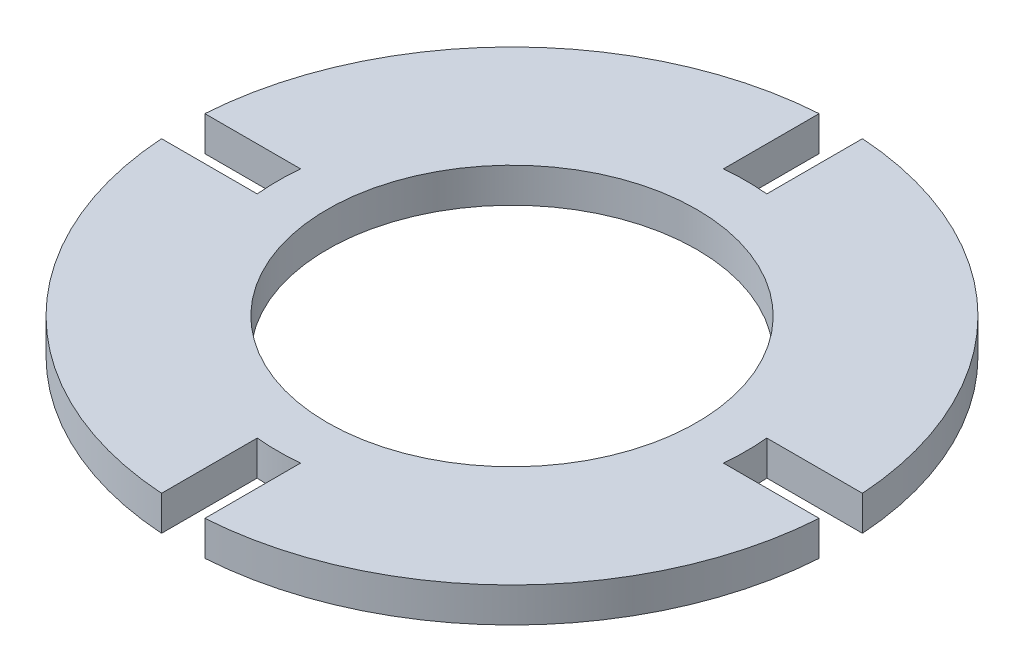
ISO-10303-21;
HEADER;
FILE_DESCRIPTION(('STEP AP214'),'2;1');
FILE_NAME('part.step','',(''),(''),'','','');
FILE_SCHEMA(('AUTOMOTIVE_DESIGN { 1 0 10303 214 1 1 1 1 }'));
ENDSEC;
DATA;
#1=APPLICATION_CONTEXT('core data for automotive mechanical design processes');
#2=APPLICATION_PROTOCOL_DEFINITION('international standard','automotive_design',2000,#1);
#3=PRODUCT_CONTEXT('',#1,'mechanical');
#4=PRODUCT('Part','Part','',(#3));
#5=PRODUCT_RELATED_PRODUCT_CATEGORY('part','',(#4));
#6=PRODUCT_DEFINITION_FORMATION('','',#4);
#7=PRODUCT_DEFINITION_CONTEXT('part definition',#1,'design');
#8=PRODUCT_DEFINITION('design','',#6,#7);
#9=PRODUCT_DEFINITION_SHAPE('','',#8);
#10=(LENGTH_UNIT() NAMED_UNIT(*) SI_UNIT(.MILLI.,.METRE.));
#11=(NAMED_UNIT(*) PLANE_ANGLE_UNIT() SI_UNIT($,.RADIAN.));
#12=(NAMED_UNIT(*) SI_UNIT($,.STERADIAN.) SOLID_ANGLE_UNIT());
#13=UNCERTAINTY_MEASURE_WITH_UNIT(LENGTH_MEASURE(1.E-05),#10,'distance_accuracy_value','');
#14=(GEOMETRIC_REPRESENTATION_CONTEXT(3) GLOBAL_UNCERTAINTY_ASSIGNED_CONTEXT((#13)) GLOBAL_UNIT_ASSIGNED_CONTEXT((#10,
#11,#12)) REPRESENTATION_CONTEXT('',''));
#15=CARTESIAN_POINT('',(0.,0.,0.));
#16=DIRECTION('',(0.,0.,1.));
#17=DIRECTION('',(1.,0.,0.));
#18=AXIS2_PLACEMENT_3D('',#15,#16,#17);
#19=CARTESIAN_POINT('',(3.17500000000001,5.08,0.));
#20=DIRECTION('',(1.,0.,0.));
#21=DIRECTION('',(0.,0.,-1.));
#22=AXIS2_PLACEMENT_3D('',#19,#20,#21);
#23=PLANE('',#22);
#24=DIRECTION('',(0.,0.,1.));
#25=VECTOR('',#24,1.);
#26=CARTESIAN_POINT('',(3.17500000000001,0.,0.));
#27=LINE('',#26,#25);
#28=CARTESIAN_POINT('',(3.17500000000001,0.,-48.1554459537029));
#29=VERTEX_POINT('',#28);
#30=CARTESIAN_POINT('',(3.17500000000001,0.,-34.142692849276));
#31=VERTEX_POINT('',#30);
#32=EDGE_CURVE('E183',#29,#31,#27,.T.);
#33=ORIENTED_EDGE('',*,*,#32,.T.);
#34=DIRECTION('',(0.,-1.,0.));
#35=VECTOR('',#34,1.);
#36=CARTESIAN_POINT('',(3.17500000000001,5.08,-34.142692849276));
#37=LINE('',#36,#35);
#38=CARTESIAN_POINT('',(3.17500000000001,5.08,-34.142692849276));
#39=VERTEX_POINT('',#38);
#40=EDGE_CURVE('E11',#39,#31,#37,.T.);
#41=ORIENTED_EDGE('',*,*,#40,.F.);
#42=DIRECTION('',(0.,0.,1.));
#43=VECTOR('',#42,1.);
#44=CARTESIAN_POINT('',(3.17500000000001,5.08,0.));
#45=LINE('',#44,#43);
#46=CARTESIAN_POINT('',(3.17500000000001,5.08,-48.1554459537029));
#47=VERTEX_POINT('',#46);
#48=EDGE_CURVE('E312',#47,#39,#45,.T.);
#49=ORIENTED_EDGE('',*,*,#48,.F.);
#50=DIRECTION('',(0.,-1.,0.));
#51=VECTOR('',#50,1.);
#52=CARTESIAN_POINT('',(3.17500000000001,5.08,-48.1554459537029));
#53=LINE('',#52,#51);
#54=EDGE_CURVE('E177',#47,#29,#53,.T.);
#55=ORIENTED_EDGE('',*,*,#54,.T.);
#56=EDGE_LOOP('',(#33,#41,#49,#55));
#57=FACE_BOUND('',#56,.T.);
#58=ADVANCED_FACE('F38',(#57),#23,.F.);
#59=CARTESIAN_POINT('',(0.,5.08,0.));
#60=DIRECTION('',(0.,-1.,0.));
#61=DIRECTION('',(0.,0.,-1.));
#62=AXIS2_PLACEMENT_3D('',#59,#60,#61);
#63=CYLINDRICAL_SURFACE('',#62,34.29);
#64=CARTESIAN_POINT('',(0.,0.,0.));
#65=DIRECTION('',(0.,1.,0.));
#66=DIRECTION('',(0.,0.,1.));
#67=AXIS2_PLACEMENT_3D('',#64,#65,#66);
#68=CIRCLE('',#67,34.29);
#69=CARTESIAN_POINT('',(-3.17500000000001,0.,-34.142692849276));
#70=VERTEX_POINT('',#69);
#71=EDGE_CURVE('E186',#31,#70,#68,.T.);
#72=ORIENTED_EDGE('',*,*,#71,.T.);
#73=DIRECTION('',(0.,-1.,0.));
#74=VECTOR('',#73,1.);
#75=CARTESIAN_POINT('',(-3.17500000000001,5.08,-34.142692849276));
#76=LINE('',#75,#74);
#77=CARTESIAN_POINT('',(-3.17500000000001,5.08,-34.142692849276));
#78=VERTEX_POINT('',#77);
#79=EDGE_CURVE('E46',#78,#70,#76,.T.);
#80=ORIENTED_EDGE('',*,*,#79,.F.);
#81=CARTESIAN_POINT('',(0.,5.08,0.));
#82=DIRECTION('',(0.,1.,0.));
#83=DIRECTION('',(0.,0.,1.));
#84=AXIS2_PLACEMENT_3D('',#81,#82,#83);
#85=CIRCLE('',#84,34.29);
#86=EDGE_CURVE('E121',#39,#78,#85,.T.);
#87=ORIENTED_EDGE('',*,*,#86,.F.);
#88=ORIENTED_EDGE('',*,*,#40,.T.);
#89=EDGE_LOOP('',(#72,#80,#87,#88));
#90=FACE_BOUND('',#89,.T.);
#91=ADVANCED_FACE('F249',(#90),#63,.T.);
#92=CARTESIAN_POINT('',(-3.17500000000001,5.08,0.));
#93=DIRECTION('',(1.,0.,0.));
#94=DIRECTION('',(0.,0.,-1.));
#95=AXIS2_PLACEMENT_3D('',#92,#93,#94);
#96=PLANE('',#95);
#97=DIRECTION('',(0.,0.,1.));
#98=VECTOR('',#97,1.);
#99=CARTESIAN_POINT('',(-3.17500000000001,0.,0.));
#100=LINE('',#99,#98);
#101=CARTESIAN_POINT('',(-3.17500000000001,0.,-48.1554459537029));
#102=VERTEX_POINT('',#101);
#103=EDGE_CURVE('E190',#102,#70,#100,.T.);
#104=ORIENTED_EDGE('',*,*,#103,.F.);
#105=DIRECTION('',(0.,-1.,0.));
#106=VECTOR('',#105,1.);
#107=CARTESIAN_POINT('',(-3.17500000000001,5.08,-48.1554459537029));
#108=LINE('',#107,#106);
#109=CARTESIAN_POINT('',(-3.17500000000001,5.08,-48.1554459537029));
#110=VERTEX_POINT('',#109);
#111=EDGE_CURVE('E242',#110,#102,#108,.T.);
#112=ORIENTED_EDGE('',*,*,#111,.F.);
#113=DIRECTION('',(0.,0.,1.));
#114=VECTOR('',#113,1.);
#115=CARTESIAN_POINT('',(-3.17500000000001,5.08,0.));
#116=LINE('',#115,#114);
#117=EDGE_CURVE('E248',#110,#78,#116,.T.);
#118=ORIENTED_EDGE('',*,*,#117,.T.);
#119=ORIENTED_EDGE('',*,*,#79,.T.);
#120=EDGE_LOOP('',(#104,#112,#118,#119));
#121=FACE_BOUND('',#120,.T.);
#122=ADVANCED_FACE('F246',(#121),#96,.T.);
#123=CARTESIAN_POINT('',(0.,5.08,0.));
#124=DIRECTION('',(0.,-1.,0.));
#125=DIRECTION('',(0.,0.,-1.));
#126=AXIS2_PLACEMENT_3D('',#123,#124,#125);
#127=CYLINDRICAL_SURFACE('',#126,48.26);
#128=CARTESIAN_POINT('',(0.,0.,0.));
#129=DIRECTION('',(0.,1.,0.));
#130=DIRECTION('',(0.,0.,1.));
#131=AXIS2_PLACEMENT_3D('',#128,#129,#130);
#132=CIRCLE('',#131,48.26);
#133=CARTESIAN_POINT('',(-48.1554459537029,0.,-3.17500000000001));
#134=VERTEX_POINT('',#133);
#135=EDGE_CURVE('E193',#102,#134,#132,.T.);
#136=ORIENTED_EDGE('',*,*,#135,.T.);
#137=DIRECTION('',(0.,-1.,0.));
#138=VECTOR('',#137,1.);
#139=CARTESIAN_POINT('',(-48.1554459537029,5.08,-3.17500000000001));
#140=LINE('',#139,#138);
#141=CARTESIAN_POINT('',(-48.1554459537029,5.08,-3.17500000000001));
#142=VERTEX_POINT('',#141);
#143=EDGE_CURVE('E239',#142,#134,#140,.T.);
#144=ORIENTED_EDGE('',*,*,#143,.F.);
#145=CARTESIAN_POINT('',(0.,5.08,0.));
#146=DIRECTION('',(0.,1.,0.));
#147=DIRECTION('',(0.,0.,1.));
#148=AXIS2_PLACEMENT_3D('',#145,#146,#147);
#149=CIRCLE('',#148,48.26);
#150=EDGE_CURVE('E180',#110,#142,#149,.T.);
#151=ORIENTED_EDGE('',*,*,#150,.F.);
#152=ORIENTED_EDGE('',*,*,#111,.T.);
#153=EDGE_LOOP('',(#136,#144,#151,#152));
#154=FACE_BOUND('',#153,.T.);
#155=ADVANCED_FACE('F259',(#154),#127,.T.);
#156=CARTESIAN_POINT('',(0.,5.08,-3.17500000000001));
#157=DIRECTION('',(0.,0.,-1.));
#158=DIRECTION('',(-1.,0.,0.));
#159=AXIS2_PLACEMENT_3D('',#156,#157,#158);
#160=PLANE('',#159);
#161=DIRECTION('',(1.,0.,0.));
#162=VECTOR('',#161,1.);
#163=CARTESIAN_POINT('',(0.,0.,-3.17500000000001));
#164=LINE('',#163,#162);
#165=CARTESIAN_POINT('',(-34.142692849276,0.,-3.17500000000001));
#166=VERTEX_POINT('',#165);
#167=EDGE_CURVE('E195',#134,#166,#164,.T.);
#168=ORIENTED_EDGE('',*,*,#167,.T.);
#169=DIRECTION('',(0.,-1.,0.));
#170=VECTOR('',#169,1.);
#171=CARTESIAN_POINT('',(-34.142692849276,5.08,-3.17500000000001));
#172=LINE('',#171,#170);
#173=CARTESIAN_POINT('',(-34.142692849276,5.08,-3.17500000000001));
#174=VERTEX_POINT('',#173);
#175=EDGE_CURVE('E236',#174,#166,#172,.T.);
#176=ORIENTED_EDGE('',*,*,#175,.F.);
#177=DIRECTION('',(1.,0.,0.));
#178=VECTOR('',#177,1.);
#179=CARTESIAN_POINT('',(0.,5.08,-3.17500000000001));
#180=LINE('',#179,#178);
#181=EDGE_CURVE('E265',#142,#174,#180,.T.);
#182=ORIENTED_EDGE('',*,*,#181,.F.);
#183=ORIENTED_EDGE('',*,*,#143,.T.);
#184=EDGE_LOOP('',(#168,#176,#182,#183));
#185=FACE_BOUND('',#184,.T.);
#186=ADVANCED_FACE('F263',(#185),#160,.F.);
#187=CARTESIAN_POINT('',(0.,5.08,0.));
#188=DIRECTION('',(0.,-1.,0.));
#189=DIRECTION('',(0.,0.,-1.));
#190=AXIS2_PLACEMENT_3D('',#187,#188,#189);
#191=CYLINDRICAL_SURFACE('',#190,34.29);
#192=CARTESIAN_POINT('',(0.,0.,0.));
#193=DIRECTION('',(0.,1.,0.));
#194=DIRECTION('',(0.,0.,1.));
#195=AXIS2_PLACEMENT_3D('',#192,#193,#194);
#196=CIRCLE('',#195,34.29);
#197=CARTESIAN_POINT('',(-34.142692849276,0.,3.17500000000001));
#198=VERTEX_POINT('',#197);
#199=EDGE_CURVE('E198',#166,#198,#196,.T.);
#200=ORIENTED_EDGE('',*,*,#199,.T.);
#201=DIRECTION('',(0.,-1.,0.));
#202=VECTOR('',#201,1.);
#203=CARTESIAN_POINT('',(-34.142692849276,5.08,3.17500000000001));
#204=LINE('',#203,#202);
#205=CARTESIAN_POINT('',(-34.142692849276,5.08,3.17500000000001));
#206=VERTEX_POINT('',#205);
#207=EDGE_CURVE('E234',#206,#198,#204,.T.);
#208=ORIENTED_EDGE('',*,*,#207,.F.);
#209=CARTESIAN_POINT('',(0.,5.08,0.));
#210=DIRECTION('',(0.,1.,0.));
#211=DIRECTION('',(0.,0.,1.));
#212=AXIS2_PLACEMENT_3D('',#209,#210,#211);
#213=CIRCLE('',#212,34.29);
#214=EDGE_CURVE('E267',#174,#206,#213,.T.);
#215=ORIENTED_EDGE('',*,*,#214,.F.);
#216=ORIENTED_EDGE('',*,*,#175,.T.);
#217=EDGE_LOOP('',(#200,#208,#215,#216));
#218=FACE_BOUND('',#217,.T.);
#219=ADVANCED_FACE('F351',(#218),#191,.T.);
#220=CARTESIAN_POINT('',(0.,5.08,3.17500000000001));
#221=DIRECTION('',(0.,0.,-1.));
#222=DIRECTION('',(-1.,0.,0.));
#223=AXIS2_PLACEMENT_3D('',#220,#221,#222);
#224=PLANE('',#223);
#225=DIRECTION('',(1.,0.,0.));
#226=VECTOR('',#225,1.);
#227=CARTESIAN_POINT('',(0.,0.,3.17500000000001));
#228=LINE('',#227,#226);
#229=CARTESIAN_POINT('',(-48.1554459537029,0.,3.17500000000001));
#230=VERTEX_POINT('',#229);
#231=EDGE_CURVE('E201',#230,#198,#228,.T.);
#232=ORIENTED_EDGE('',*,*,#231,.F.);
#233=DIRECTION('',(0.,-1.,0.));
#234=VECTOR('',#233,1.);
#235=CARTESIAN_POINT('',(-48.1554459537029,5.08,3.17500000000001));
#236=LINE('',#235,#234);
#237=CARTESIAN_POINT('',(-48.1554459537029,5.08,3.17500000000001));
#238=VERTEX_POINT('',#237);
#239=EDGE_CURVE('E232',#238,#230,#236,.T.);
#240=ORIENTED_EDGE('',*,*,#239,.F.);
#241=DIRECTION('',(1.,0.,0.));
#242=VECTOR('',#241,1.);
#243=CARTESIAN_POINT('',(0.,5.08,3.17500000000001));
#244=LINE('',#243,#242);
#245=EDGE_CURVE('E269',#238,#206,#244,.T.);
#246=ORIENTED_EDGE('',*,*,#245,.T.);
#247=ORIENTED_EDGE('',*,*,#207,.T.);
#248=EDGE_LOOP('',(#232,#240,#246,#247));
#249=FACE_BOUND('',#248,.T.);
#250=ADVANCED_FACE('F354',(#249),#224,.T.);
#251=CARTESIAN_POINT('',(-3.175,0.,48.1554459537029));
#252=VERTEX_POINT('',#251);
#253=EDGE_CURVE('E196',#230,#252,#132,.T.);
#254=ORIENTED_EDGE('',*,*,#253,.T.);
#255=DIRECTION('',(0.,-1.,0.));
#256=VECTOR('',#255,1.);
#257=CARTESIAN_POINT('',(-3.175,5.08,48.1554459537029));
#258=LINE('',#257,#256);
#259=CARTESIAN_POINT('',(-3.175,5.08,48.1554459537029));
#260=VERTEX_POINT('',#259);
#261=EDGE_CURVE('E230',#260,#252,#258,.T.);
#262=ORIENTED_EDGE('',*,*,#261,.F.);
#263=EDGE_CURVE('E271',#238,#260,#149,.T.);
#264=ORIENTED_EDGE('',*,*,#263,.F.);
#265=ORIENTED_EDGE('',*,*,#239,.T.);
#266=EDGE_LOOP('',(#254,#262,#264,#265));
#267=FACE_BOUND('',#266,.T.);
#268=ADVANCED_FACE('F291',(#267),#127,.T.);
#269=CARTESIAN_POINT('',(-3.17500000000001,5.08,0.));
#270=DIRECTION('',(1.,0.,0.));
#271=DIRECTION('',(0.,0.,-1.));
#272=AXIS2_PLACEMENT_3D('',#269,#270,#271);
#273=PLANE('',#272);
#274=DIRECTION('',(0.,0.,1.));
#275=VECTOR('',#274,1.);
#276=CARTESIAN_POINT('',(-3.17500000000001,0.,0.));
#277=LINE('',#276,#275);
#278=CARTESIAN_POINT('',(-3.175,0.,34.142692849276));
#279=VERTEX_POINT('',#278);
#280=EDGE_CURVE('E204',#279,#252,#277,.T.);
#281=ORIENTED_EDGE('',*,*,#280,.F.);
#282=DIRECTION('',(0.,-1.,0.));
#283=VECTOR('',#282,1.);
#284=CARTESIAN_POINT('',(-3.175,5.08,34.142692849276));
#285=LINE('',#284,#283);
#286=CARTESIAN_POINT('',(-3.175,5.08,34.142692849276));
#287=VERTEX_POINT('',#286);
#288=EDGE_CURVE('E228',#287,#279,#285,.T.);
#289=ORIENTED_EDGE('',*,*,#288,.F.);
#290=DIRECTION('',(0.,0.,1.));
#291=VECTOR('',#290,1.);
#292=CARTESIAN_POINT('',(-3.17500000000001,5.08,0.));
#293=LINE('',#292,#291);
#294=EDGE_CURVE('E276',#287,#260,#293,.T.);
#295=ORIENTED_EDGE('',*,*,#294,.T.);
#296=ORIENTED_EDGE('',*,*,#261,.T.);
#297=EDGE_LOOP('',(#281,#289,#295,#296));
#298=FACE_BOUND('',#297,.T.);
#299=ADVANCED_FACE('F295',(#298),#273,.T.);
#300=CARTESIAN_POINT('',(0.,5.08,0.));
#301=DIRECTION('',(0.,-1.,0.));
#302=DIRECTION('',(0.,0.,-1.));
#303=AXIS2_PLACEMENT_3D('',#300,#301,#302);
#304=CYLINDRICAL_SURFACE('',#303,34.29);
#305=CARTESIAN_POINT('',(0.,0.,0.));
#306=DIRECTION('',(0.,1.,0.));
#307=DIRECTION('',(0.,0.,1.));
#308=AXIS2_PLACEMENT_3D('',#305,#306,#307);
#309=CIRCLE('',#308,34.29);
#310=CARTESIAN_POINT('',(3.175,0.,34.142692849276));
#311=VERTEX_POINT('',#310);
#312=EDGE_CURVE('E207',#279,#311,#309,.T.);
#313=ORIENTED_EDGE('',*,*,#312,.T.);
#314=DIRECTION('',(0.,-1.,0.));
#315=VECTOR('',#314,1.);
#316=CARTESIAN_POINT('',(3.175,5.08,34.142692849276));
#317=LINE('',#316,#315);
#318=CARTESIAN_POINT('',(3.175,5.08,34.142692849276));
#319=VERTEX_POINT('',#318);
#320=EDGE_CURVE('E225',#319,#311,#317,.T.);
#321=ORIENTED_EDGE('',*,*,#320,.F.);
#322=CARTESIAN_POINT('',(0.,5.08,0.));
#323=DIRECTION('',(0.,1.,0.));
#324=DIRECTION('',(0.,0.,1.));
#325=AXIS2_PLACEMENT_3D('',#322,#323,#324);
#326=CIRCLE('',#325,34.29);
#327=EDGE_CURVE('E279',#287,#319,#326,.T.);
#328=ORIENTED_EDGE('',*,*,#327,.F.);
#329=ORIENTED_EDGE('',*,*,#288,.T.);
#330=EDGE_LOOP('',(#313,#321,#328,#329));
#331=FACE_BOUND('',#330,.T.);
#332=ADVANCED_FACE('F300',(#331),#304,.T.);
#333=CARTESIAN_POINT('',(3.17500000000001,5.08,0.));
#334=DIRECTION('',(1.,0.,0.));
#335=DIRECTION('',(0.,0.,-1.));
#336=AXIS2_PLACEMENT_3D('',#333,#334,#335);
#337=PLANE('',#336);
#338=DIRECTION('',(0.,0.,1.));
#339=VECTOR('',#338,1.);
#340=CARTESIAN_POINT('',(3.17500000000001,0.,0.));
#341=LINE('',#340,#339);
#342=CARTESIAN_POINT('',(3.175,0.,48.1554459537029));
#343=VERTEX_POINT('',#342);
#344=EDGE_CURVE('E209',#311,#343,#341,.T.);
#345=ORIENTED_EDGE('',*,*,#344,.T.);
#346=DIRECTION('',(0.,-1.,0.));
#347=VECTOR('',#346,1.);
#348=CARTESIAN_POINT('',(3.175,5.08,48.1554459537029));
#349=LINE('',#348,#347);
#350=CARTESIAN_POINT('',(3.175,5.08,48.1554459537029));
#351=VERTEX_POINT('',#350);
#352=EDGE_CURVE('E222',#351,#343,#349,.T.);
#353=ORIENTED_EDGE('',*,*,#352,.F.);
#354=DIRECTION('',(0.,0.,1.));
#355=VECTOR('',#354,1.);
#356=CARTESIAN_POINT('',(3.17500000000001,5.08,0.));
#357=LINE('',#356,#355);
#358=EDGE_CURVE('E281',#319,#351,#357,.T.);
#359=ORIENTED_EDGE('',*,*,#358,.F.);
#360=ORIENTED_EDGE('',*,*,#320,.T.);
#361=EDGE_LOOP('',(#345,#353,#359,#360));
#362=FACE_BOUND('',#361,.T.);
#363=ADVANCED_FACE('F304',(#362),#337,.F.);
#364=CARTESIAN_POINT('',(48.1554459537029,0.,3.17500000000001));
#365=VERTEX_POINT('',#364);
#366=EDGE_CURVE('E211',#343,#365,#132,.T.);
#367=ORIENTED_EDGE('',*,*,#366,.T.);
#368=DIRECTION('',(0.,-1.,0.));
#369=VECTOR('',#368,1.);
#370=CARTESIAN_POINT('',(48.1554459537029,5.08,3.17500000000001));
#371=LINE('',#370,#369);
#372=CARTESIAN_POINT('',(48.1554459537029,5.08,3.17500000000001));
#373=VERTEX_POINT('',#372);
#374=EDGE_CURVE('E220',#373,#365,#371,.T.);
#375=ORIENTED_EDGE('',*,*,#374,.F.);
#376=EDGE_CURVE('E179',#351,#373,#149,.T.);
#377=ORIENTED_EDGE('',*,*,#376,.F.);
#378=ORIENTED_EDGE('',*,*,#352,.T.);
#379=EDGE_LOOP('',(#367,#375,#377,#378));
#380=FACE_BOUND('',#379,.T.);
#381=ADVANCED_FACE('F309',(#380),#127,.T.);
#382=CARTESIAN_POINT('',(0.,5.08,3.17500000000001));
#383=DIRECTION('',(0.,0.,-1.));
#384=DIRECTION('',(-1.,0.,0.));
#385=AXIS2_PLACEMENT_3D('',#382,#383,#384);
#386=PLANE('',#385);
#387=DIRECTION('',(1.,0.,0.));
#388=VECTOR('',#387,1.);
#389=CARTESIAN_POINT('',(0.,0.,3.17500000000001));
#390=LINE('',#389,#388);
#391=CARTESIAN_POINT('',(34.142692849276,0.,3.17500000000001));
#392=VERTEX_POINT('',#391);
#393=EDGE_CURVE('E212',#392,#365,#390,.T.);
#394=ORIENTED_EDGE('',*,*,#393,.F.);
#395=DIRECTION('',(0.,-1.,0.));
#396=VECTOR('',#395,1.);
#397=CARTESIAN_POINT('',(34.142692849276,5.08,3.17500000000001));
#398=LINE('',#397,#396);
#399=CARTESIAN_POINT('',(34.142692849276,5.08,3.17500000000001));
#400=VERTEX_POINT('',#399);
#401=EDGE_CURVE('E172',#400,#392,#398,.T.);
#402=ORIENTED_EDGE('',*,*,#401,.F.);
#403=DIRECTION('',(1.,0.,0.));
#404=VECTOR('',#403,1.);
#405=CARTESIAN_POINT('',(0.,5.08,3.17500000000001));
#406=LINE('',#405,#404);
#407=EDGE_CURVE('E165',#400,#373,#406,.T.);
#408=ORIENTED_EDGE('',*,*,#407,.T.);
#409=ORIENTED_EDGE('',*,*,#374,.T.);
#410=EDGE_LOOP('',(#394,#402,#408,#409));
#411=FACE_BOUND('',#410,.T.);
#412=ADVANCED_FACE('F311',(#411),#386,.T.);
#413=CARTESIAN_POINT('',(0.,5.08,0.));
#414=DIRECTION('',(0.,-1.,0.));
#415=DIRECTION('',(0.,0.,-1.));
#416=AXIS2_PLACEMENT_3D('',#413,#414,#415);
#417=CYLINDRICAL_SURFACE('',#416,34.29);
#418=CARTESIAN_POINT('',(0.,0.,0.));
#419=DIRECTION('',(0.,1.,0.));
#420=DIRECTION('',(0.,0.,1.));
#421=AXIS2_PLACEMENT_3D('',#418,#419,#420);
#422=CIRCLE('',#421,34.29);
#423=CARTESIAN_POINT('',(34.142692849276,0.,-3.17500000000001));
#424=VERTEX_POINT('',#423);
#425=EDGE_CURVE('E171',#392,#424,#422,.T.);
#426=ORIENTED_EDGE('',*,*,#425,.T.);
#427=DIRECTION('',(0.,-1.,0.));
#428=VECTOR('',#427,1.);
#429=CARTESIAN_POINT('',(34.142692849276,5.08,-3.17500000000001));
#430=LINE('',#429,#428);
#431=CARTESIAN_POINT('',(34.142692849276,5.08,-3.17500000000001));
#432=VERTEX_POINT('',#431);
#433=EDGE_CURVE('E168',#432,#424,#430,.T.);
#434=ORIENTED_EDGE('',*,*,#433,.F.);
#435=CARTESIAN_POINT('',(0.,5.08,0.));
#436=DIRECTION('',(0.,1.,0.));
#437=DIRECTION('',(0.,0.,1.));
#438=AXIS2_PLACEMENT_3D('',#435,#436,#437);
#439=CIRCLE('',#438,34.29);
#440=EDGE_CURVE('E159',#400,#432,#439,.T.);
#441=ORIENTED_EDGE('',*,*,#440,.F.);
#442=ORIENTED_EDGE('',*,*,#401,.T.);
#443=EDGE_LOOP('',(#426,#434,#441,#442));
#444=FACE_BOUND('',#443,.T.);
#445=ADVANCED_FACE('F169',(#444),#417,.T.);
#446=CARTESIAN_POINT('',(0.,5.08,-3.17500000000001));
#447=DIRECTION('',(0.,0.,-1.));
#448=DIRECTION('',(-1.,0.,0.));
#449=AXIS2_PLACEMENT_3D('',#446,#447,#448);
#450=PLANE('',#449);
#451=DIRECTION('',(1.,0.,0.));
#452=VECTOR('',#451,1.);
#453=CARTESIAN_POINT('',(0.,0.,-3.17500000000001));
#454=LINE('',#453,#452);
#455=CARTESIAN_POINT('',(48.1554459537029,0.,-3.17500000000001));
#456=VERTEX_POINT('',#455);
#457=EDGE_CURVE('E107',#424,#456,#454,.T.);
#458=ORIENTED_EDGE('',*,*,#457,.T.);
#459=DIRECTION('',(0.,-1.,0.));
#460=VECTOR('',#459,1.);
#461=CARTESIAN_POINT('',(48.1554459537029,5.08,-3.17500000000001));
#462=LINE('',#461,#460);
#463=CARTESIAN_POINT('',(48.1554459537029,5.08,-3.17500000000001));
#464=VERTEX_POINT('',#463);
#465=EDGE_CURVE('E173',#464,#456,#462,.T.);
#466=ORIENTED_EDGE('',*,*,#465,.F.);
#467=DIRECTION('',(1.,0.,0.));
#468=VECTOR('',#467,1.);
#469=CARTESIAN_POINT('',(0.,5.08,-3.17500000000001));
#470=LINE('',#469,#468);
#471=EDGE_CURVE('E163',#432,#464,#470,.T.);
#472=ORIENTED_EDGE('',*,*,#471,.F.);
#473=ORIENTED_EDGE('',*,*,#433,.T.);
#474=EDGE_LOOP('',(#458,#466,#472,#473));
#475=FACE_BOUND('',#474,.T.);
#476=ADVANCED_FACE('F175',(#475),#450,.F.);
#477=EDGE_CURVE('E113',#456,#29,#132,.T.);
#478=ORIENTED_EDGE('',*,*,#477,.T.);
#479=ORIENTED_EDGE('',*,*,#54,.F.);
#480=EDGE_CURVE('E54',#464,#47,#149,.T.);
#481=ORIENTED_EDGE('',*,*,#480,.F.);
#482=ORIENTED_EDGE('',*,*,#465,.T.);
#483=EDGE_LOOP('',(#478,#479,#481,#482));
#484=FACE_BOUND('',#483,.T.);
#485=ADVANCED_FACE('F331',(#484),#127,.T.);
#486=CARTESIAN_POINT('',(0.,5.08,0.));
#487=DIRECTION('',(0.,1.,0.));
#488=DIRECTION('',(0.,0.,1.));
#489=AXIS2_PLACEMENT_3D('',#486,#487,#488);
#490=PLANE('',#489);
#491=CARTESIAN_POINT('',(0.,5.08,0.));
#492=DIRECTION('',(0.,1.,0.));
#493=DIRECTION('',(0.,0.,1.));
#494=AXIS2_PLACEMENT_3D('',#491,#492,#493);
#495=CIRCLE('',#494,27.051);
#496=CARTESIAN_POINT('',(0.,5.08,27.051));
#497=VERTEX_POINT('',#496);
#498=EDGE_CURVE('E317',#497,#497,#495,.T.);
#499=ORIENTED_EDGE('',*,*,#498,.F.);
#500=EDGE_LOOP('',(#499));
#501=FACE_BOUND('',#500,.T.);
#502=ORIENTED_EDGE('',*,*,#48,.T.);
#503=ORIENTED_EDGE('',*,*,#86,.T.);
#504=ORIENTED_EDGE('',*,*,#117,.F.);
#505=ORIENTED_EDGE('',*,*,#150,.T.);
#506=ORIENTED_EDGE('',*,*,#181,.T.);
#507=ORIENTED_EDGE('',*,*,#214,.T.);
#508=ORIENTED_EDGE('',*,*,#245,.F.);
#509=ORIENTED_EDGE('',*,*,#263,.T.);
#510=ORIENTED_EDGE('',*,*,#294,.F.);
#511=ORIENTED_EDGE('',*,*,#327,.T.);
#512=ORIENTED_EDGE('',*,*,#358,.T.);
#513=ORIENTED_EDGE('',*,*,#376,.T.);
#514=ORIENTED_EDGE('',*,*,#407,.F.);
#515=ORIENTED_EDGE('',*,*,#440,.T.);
#516=ORIENTED_EDGE('',*,*,#471,.T.);
#517=ORIENTED_EDGE('',*,*,#480,.T.);
#518=EDGE_LOOP('',(#502,#503,#504,#505,#506,#507,#508,#509,#510,#511,#512,#513,#514,#515,#516,#517));
#519=FACE_BOUND('',#518,.T.);
#520=ADVANCED_FACE('F161',(#501,#519),#490,.T.);
#521=CARTESIAN_POINT('',(0.,0.,0.));
#522=DIRECTION('',(0.,1.,0.));
#523=DIRECTION('',(0.,0.,1.));
#524=AXIS2_PLACEMENT_3D('',#521,#522,#523);
#525=PLANE('',#524);
#526=CARTESIAN_POINT('',(0.,0.,0.));
#527=DIRECTION('',(0.,1.,0.));
#528=DIRECTION('',(0.,0.,1.));
#529=AXIS2_PLACEMENT_3D('',#526,#527,#528);
#530=CIRCLE('',#529,27.051);
#531=CARTESIAN_POINT('',(0.,0.,27.051));
#532=VERTEX_POINT('',#531);
#533=EDGE_CURVE('E187',#532,#532,#530,.T.);
#534=ORIENTED_EDGE('',*,*,#533,.T.);
#535=EDGE_LOOP('',(#534));
#536=FACE_BOUND('',#535,.T.);
#537=ORIENTED_EDGE('',*,*,#32,.F.);
#538=ORIENTED_EDGE('',*,*,#477,.F.);
#539=ORIENTED_EDGE('',*,*,#457,.F.);
#540=ORIENTED_EDGE('',*,*,#425,.F.);
#541=ORIENTED_EDGE('',*,*,#393,.T.);
#542=ORIENTED_EDGE('',*,*,#366,.F.);
#543=ORIENTED_EDGE('',*,*,#344,.F.);
#544=ORIENTED_EDGE('',*,*,#312,.F.);
#545=ORIENTED_EDGE('',*,*,#280,.T.);
#546=ORIENTED_EDGE('',*,*,#253,.F.);
#547=ORIENTED_EDGE('',*,*,#231,.T.);
#548=ORIENTED_EDGE('',*,*,#199,.F.);
#549=ORIENTED_EDGE('',*,*,#167,.F.);
#550=ORIENTED_EDGE('',*,*,#135,.F.);
#551=ORIENTED_EDGE('',*,*,#103,.T.);
#552=ORIENTED_EDGE('',*,*,#71,.F.);
#553=EDGE_LOOP('',(#537,#538,#539,#540,#541,#542,#543,#544,#545,#546,#547,#548,#549,#550,#551,#552));
#554=FACE_BOUND('',#553,.T.);
#555=ADVANCED_FACE('F254',(#536,#554),#525,.F.);
#556=CARTESIAN_POINT('',(0.,0.,0.));
#557=DIRECTION('',(0.,1.,0.));
#558=DIRECTION('',(0.,0.,1.));
#559=AXIS2_PLACEMENT_3D('',#556,#557,#558);
#560=CYLINDRICAL_SURFACE('',#559,27.051);
#561=ORIENTED_EDGE('',*,*,#533,.F.);
#562=EDGE_LOOP('',(#561));
#563=FACE_BOUND('',#562,.T.);
#564=ORIENTED_EDGE('',*,*,#498,.T.);
#565=EDGE_LOOP('',(#564));
#566=FACE_BOUND('',#565,.T.);
#567=ADVANCED_FACE('F324',(#563,#566),#560,.F.);
#568=CLOSED_SHELL('',(#58,#91,#122,#155,#186,#219,#250,#268,#299,#332,#363,#381,#412,#445,#476,
#485,#520,#555,#567));
#569=MANIFOLD_SOLID_BREP('B2',#568);
#570=ADVANCED_BREP_SHAPE_REPRESENTATION('',(#18,#569),#14);
#571=SHAPE_DEFINITION_REPRESENTATION(#9,#570);
ENDSEC;
END-ISO-10303-21;
